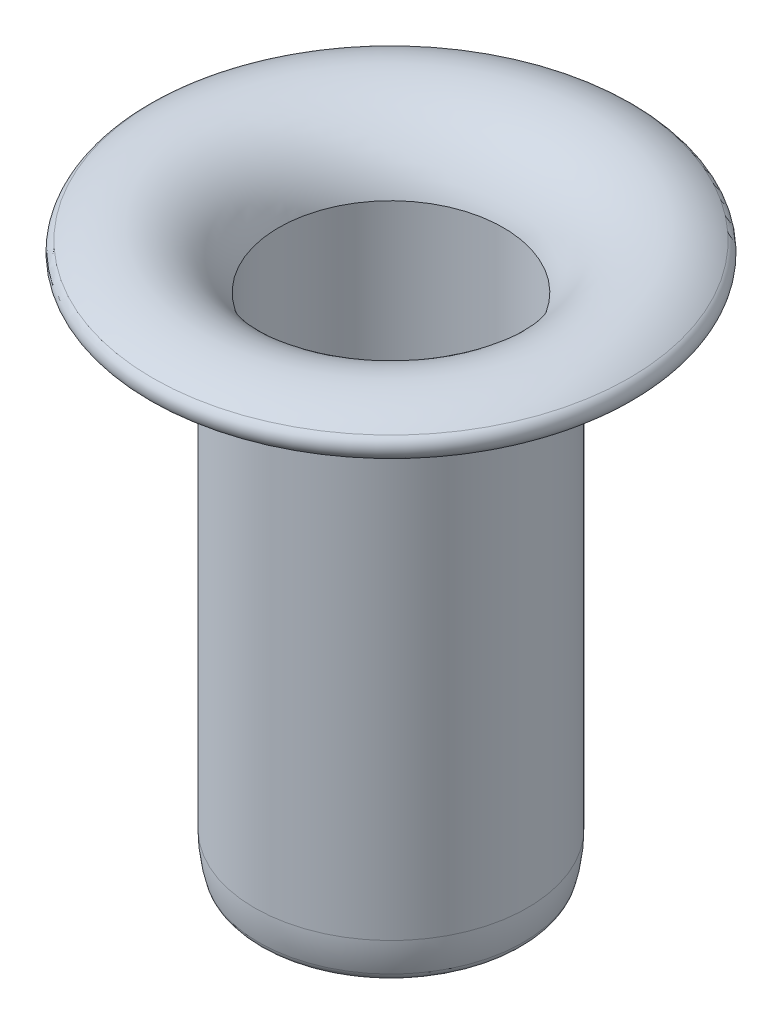
ISO-10303-21;
HEADER;
FILE_DESCRIPTION(('STEP AP214'),'2;1');
FILE_NAME('part.step','',(''),(''),'','','');
FILE_SCHEMA(('AUTOMOTIVE_DESIGN { 1 0 10303 214 1 1 1 1 }'));
ENDSEC;
DATA;
#1=APPLICATION_CONTEXT('core data for automotive mechanical design processes');
#2=APPLICATION_PROTOCOL_DEFINITION('international standard','automotive_design',2000,#1);
#3=PRODUCT_CONTEXT('',#1,'mechanical');
#4=PRODUCT('Part','Part','',(#3));
#5=PRODUCT_RELATED_PRODUCT_CATEGORY('part','',(#4));
#6=PRODUCT_DEFINITION_FORMATION('','',#4);
#7=PRODUCT_DEFINITION_CONTEXT('part definition',#1,'design');
#8=PRODUCT_DEFINITION('design','',#6,#7);
#9=PRODUCT_DEFINITION_SHAPE('','',#8);
#10=(LENGTH_UNIT() NAMED_UNIT(*) SI_UNIT(.MILLI.,.METRE.));
#11=(NAMED_UNIT(*) PLANE_ANGLE_UNIT() SI_UNIT($,.RADIAN.));
#12=(NAMED_UNIT(*) SI_UNIT($,.STERADIAN.) SOLID_ANGLE_UNIT());
#13=UNCERTAINTY_MEASURE_WITH_UNIT(LENGTH_MEASURE(1.E-05),#10,'distance_accuracy_value','');
#14=(GEOMETRIC_REPRESENTATION_CONTEXT(3) GLOBAL_UNCERTAINTY_ASSIGNED_CONTEXT((#13)) GLOBAL_UNIT_ASSIGNED_CONTEXT((#10,
#11,#12)) REPRESENTATION_CONTEXT('',''));
#15=CARTESIAN_POINT('',(0.,0.,0.));
#16=DIRECTION('',(0.,0.,1.));
#17=DIRECTION('',(1.,0.,0.));
#18=AXIS2_PLACEMENT_3D('',#15,#16,#17);
#19=CARTESIAN_POINT('',(0.,-0.117985379825303,0.));
#20=DIRECTION('',(0.,1.,0.));
#21=DIRECTION('',(0.,0.,1.));
#22=AXIS2_PLACEMENT_3D('',#19,#20,#21);
#23=TOROIDAL_SURFACE('',#22,2.405,0.125);
#24=CARTESIAN_POINT('',(0.,-0.223428063185384,0.));
#25=DIRECTION('',(0.,1.,0.));
#26=DIRECTION('',(0.,0.,1.));
#27=AXIS2_PLACEMENT_3D('',#24,#25,#26);
#28=CIRCLE('',#27,2.33786699376741);
#29=CARTESIAN_POINT('',(0.,-0.223428063185384,2.33786699376741));
#30=VERTEX_POINT('',#29);
#31=EDGE_CURVE('E61',#30,#30,#28,.T.);
#32=ORIENTED_EDGE('',*,*,#31,.T.);
#33=EDGE_LOOP('',(#32));
#34=FACE_BOUND('',#33,.T.);
#35=CARTESIAN_POINT('',(0.,-0.0125426964652215,0.));
#36=DIRECTION('',(0.,1.,0.));
#37=DIRECTION('',(0.,0.,1.));
#38=AXIS2_PLACEMENT_3D('',#35,#36,#37);
#39=CIRCLE('',#38,2.4721330062326);
#40=CARTESIAN_POINT('',(0.,-0.0125426964652215,2.4721330062326));
#41=VERTEX_POINT('',#40);
#42=EDGE_CURVE('E10',#41,#41,#39,.T.);
#43=ORIENTED_EDGE('',*,*,#42,.F.);
#44=EDGE_LOOP('',(#43));
#45=FACE_BOUND('',#44,.T.);
#46=ADVANCED_FACE('F33',(#34,#45),#23,.T.);
#47=CARTESIAN_POINT('',(0.,-0.7541,0.));
#48=DIRECTION('',(0.,1.,0.));
#49=DIRECTION('',(0.,0.,1.));
#50=AXIS2_PLACEMENT_3D('',#47,#48,#49);
#51=TOROIDAL_SURFACE('',#50,2.,0.8791);
#52=CARTESIAN_POINT('',(0.,-0.479160352077042,0.));
#53=DIRECTION('',(0.,1.,0.));
#54=DIRECTION('',(0.,0.,1.));
#55=AXIS2_PLACEMENT_3D('',#52,#53,#54);
#56=CIRCLE('',#55,1.165);
#57=CARTESIAN_POINT('',(0.,-0.479160352077042,1.165));
#58=VERTEX_POINT('',#57);
#59=EDGE_CURVE('E39',#58,#58,#56,.T.);
#60=ORIENTED_EDGE('',*,*,#59,.F.);
#61=EDGE_LOOP('',(#60));
#62=FACE_BOUND('',#61,.T.);
#63=ORIENTED_EDGE('',*,*,#42,.T.);
#64=EDGE_LOOP('',(#63));
#65=FACE_BOUND('',#64,.T.);
#66=ADVANCED_FACE('F79',(#62,#65),#51,.T.);
#67=CARTESIAN_POINT('',(0.,0.,0.));
#68=DIRECTION('',(0.,1.,0.));
#69=DIRECTION('',(0.,0.,1.));
#70=AXIS2_PLACEMENT_3D('',#67,#68,#69);
#71=CYLINDRICAL_SURFACE('',#70,1.165);
#72=CARTESIAN_POINT('',(0.,-5.3,0.));
#73=DIRECTION('',(0.,1.,0.));
#74=DIRECTION('',(0.,0.,1.));
#75=AXIS2_PLACEMENT_3D('',#72,#73,#74);
#76=CIRCLE('',#75,1.165);
#77=CARTESIAN_POINT('',(0.,-5.3,1.165));
#78=VERTEX_POINT('',#77);
#79=EDGE_CURVE('E43',#78,#78,#76,.T.);
#80=ORIENTED_EDGE('',*,*,#79,.F.);
#81=EDGE_LOOP('',(#80));
#82=FACE_BOUND('',#81,.T.);
#83=ORIENTED_EDGE('',*,*,#59,.T.);
#84=EDGE_LOOP('',(#83));
#85=FACE_BOUND('',#84,.T.);
#86=ADVANCED_FACE('F83',(#82,#85),#71,.F.);
#87=CARTESIAN_POINT('',(0.,-5.3,0.));
#88=DIRECTION('',(0.,1.,0.));
#89=DIRECTION('',(0.,0.,1.));
#90=AXIS2_PLACEMENT_3D('',#87,#88,#89);
#91=DEGENERATE_TOROIDAL_SURFACE('',#90,0.145000000000009,1.01999999999999,.T.);
#92=ORIENTED_EDGE('',*,*,#79,.T.);
#93=EDGE_LOOP('',(#92));
#94=FACE_BOUND('',#93,.T.);
#95=CARTESIAN_POINT('',(0.,-5.56724890829694,0.));
#96=DIRECTION('',(0.,1.,0.));
#97=DIRECTION('',(0.,0.,1.));
#98=AXIS2_PLACEMENT_3D('',#95,#96,#97);
#99=CIRCLE('',#98,1.12936681222707);
#100=CARTESIAN_POINT('',(0.,-5.56724890829694,1.12936681222707));
#101=VERTEX_POINT('',#100);
#102=EDGE_CURVE('E47',#101,#101,#99,.T.);
#103=ORIENTED_EDGE('',*,*,#102,.F.);
#104=EDGE_LOOP('',(#103));
#105=FACE_BOUND('',#104,.T.);
#106=ADVANCED_FACE('F88',(#94,#105),#91,.F.);
#107=CARTESIAN_POINT('',(0.,-5.6,0.));
#108=DIRECTION('',(0.,1.,0.));
#109=DIRECTION('',(0.,0.,1.));
#110=AXIS2_PLACEMENT_3D('',#107,#108,#109);
#111=TOROIDAL_SURFACE('',#110,1.25,0.125);
#112=CARTESIAN_POINT('',(0.,-5.63275109170306,0.));
#113=DIRECTION('',(0.,1.,0.));
#114=DIRECTION('',(0.,0.,1.));
#115=AXIS2_PLACEMENT_3D('',#112,#113,#114);
#116=CIRCLE('',#115,1.37063318777293);
#117=CARTESIAN_POINT('',(0.,-5.63275109170306,1.37063318777293));
#118=VERTEX_POINT('',#117);
#119=EDGE_CURVE('E52',#118,#118,#116,.T.);
#120=ORIENTED_EDGE('',*,*,#119,.F.);
#121=EDGE_LOOP('',(#120));
#122=FACE_BOUND('',#121,.T.);
#123=ORIENTED_EDGE('',*,*,#102,.T.);
#124=EDGE_LOOP('',(#123));
#125=FACE_BOUND('',#124,.T.);
#126=ADVANCED_FACE('F94',(#122,#125),#111,.T.);
#127=CARTESIAN_POINT('',(0.,-5.3,0.));
#128=DIRECTION('',(0.,1.,0.));
#129=DIRECTION('',(0.,0.,1.));
#130=AXIS2_PLACEMENT_3D('',#127,#128,#129);
#131=DEGENERATE_TOROIDAL_SURFACE('',#130,0.145000000000009,1.26999999999999,.T.);
#132=CARTESIAN_POINT('',(0.,-5.3,0.));
#133=DIRECTION('',(0.,1.,0.));
#134=DIRECTION('',(0.,0.,1.));
#135=AXIS2_PLACEMENT_3D('',#132,#133,#134);
#136=CIRCLE('',#135,1.415);
#137=CARTESIAN_POINT('',(0.,-5.3,1.415));
#138=VERTEX_POINT('',#137);
#139=EDGE_CURVE('E55',#138,#138,#136,.T.);
#140=ORIENTED_EDGE('',*,*,#139,.F.);
#141=EDGE_LOOP('',(#140));
#142=FACE_BOUND('',#141,.T.);
#143=ORIENTED_EDGE('',*,*,#119,.T.);
#144=EDGE_LOOP('',(#143));
#145=FACE_BOUND('',#144,.T.);
#146=ADVANCED_FACE('F75',(#142,#145),#131,.T.);
#147=CARTESIAN_POINT('',(0.,0.,0.));
#148=DIRECTION('',(0.,1.,0.));
#149=DIRECTION('',(0.,0.,1.));
#150=AXIS2_PLACEMENT_3D('',#147,#148,#149);
#151=CYLINDRICAL_SURFACE('',#150,1.415);
#152=ORIENTED_EDGE('',*,*,#139,.T.);
#153=EDGE_LOOP('',(#152));
#154=FACE_BOUND('',#153,.T.);
#155=CARTESIAN_POINT('',(0.,-0.522708967330193,0.));
#156=DIRECTION('',(0.,1.,0.));
#157=DIRECTION('',(0.,0.,1.));
#158=AXIS2_PLACEMENT_3D('',#155,#156,#157);
#159=CIRCLE('',#158,1.415);
#160=CARTESIAN_POINT('',(0.,-0.522708967330193,1.415));
#161=VERTEX_POINT('',#160);
#162=EDGE_CURVE('E58',#161,#161,#159,.T.);
#163=ORIENTED_EDGE('',*,*,#162,.F.);
#164=EDGE_LOOP('',(#163));
#165=FACE_BOUND('',#164,.T.);
#166=ADVANCED_FACE('F69',(#154,#165),#151,.T.);
#167=CARTESIAN_POINT('',(0.,-0.7541,0.));
#168=DIRECTION('',(0.,1.,0.));
#169=DIRECTION('',(0.,0.,1.));
#170=AXIS2_PLACEMENT_3D('',#167,#168,#169);
#171=TOROIDAL_SURFACE('',#170,2.,0.6291);
#172=ORIENTED_EDGE('',*,*,#162,.T.);
#173=EDGE_LOOP('',(#172));
#174=FACE_BOUND('',#173,.T.);
#175=ORIENTED_EDGE('',*,*,#31,.F.);
#176=EDGE_LOOP('',(#175));
#177=FACE_BOUND('',#176,.T.);
#178=ADVANCED_FACE('F67',(#174,#177),#171,.F.);
#179=CLOSED_SHELL('',(#46,#66,#86,#106,#126,#146,#166,#178));
#180=MANIFOLD_SOLID_BREP('B2',#179);
#181=ADVANCED_BREP_SHAPE_REPRESENTATION('',(#18,#180),#14);
#182=SHAPE_DEFINITION_REPRESENTATION(#9,#181);
ENDSEC;
END-ISO-10303-21;
